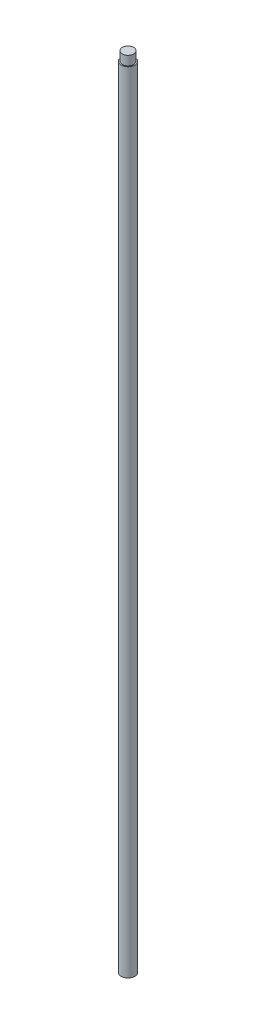
ISO-10303-21;
HEADER;
FILE_DESCRIPTION(('STEP AP214'),'2;1');
FILE_NAME('part.step','',(''),(''),'','','');
FILE_SCHEMA(('AUTOMOTIVE_DESIGN { 1 0 10303 214 1 1 1 1 }'));
ENDSEC;
DATA;
#1=APPLICATION_CONTEXT('core data for automotive mechanical design processes');
#2=APPLICATION_PROTOCOL_DEFINITION('international standard','automotive_design',2000,#1);
#3=PRODUCT_CONTEXT('',#1,'mechanical');
#4=PRODUCT('Part','Part','',(#3));
#5=PRODUCT_RELATED_PRODUCT_CATEGORY('part','',(#4));
#6=PRODUCT_DEFINITION_FORMATION('','',#4);
#7=PRODUCT_DEFINITION_CONTEXT('part definition',#1,'design');
#8=PRODUCT_DEFINITION('design','',#6,#7);
#9=PRODUCT_DEFINITION_SHAPE('','',#8);
#10=(LENGTH_UNIT() NAMED_UNIT(*) SI_UNIT(.MILLI.,.METRE.));
#11=(NAMED_UNIT(*) PLANE_ANGLE_UNIT() SI_UNIT($,.RADIAN.));
#12=(NAMED_UNIT(*) SI_UNIT($,.STERADIAN.) SOLID_ANGLE_UNIT());
#13=UNCERTAINTY_MEASURE_WITH_UNIT(LENGTH_MEASURE(1.E-05),#10,'distance_accuracy_value','');
#14=(GEOMETRIC_REPRESENTATION_CONTEXT(3) GLOBAL_UNCERTAINTY_ASSIGNED_CONTEXT((#13)) GLOBAL_UNIT_ASSIGNED_CONTEXT((#10,
#11,#12)) REPRESENTATION_CONTEXT('',''));
#15=CARTESIAN_POINT('',(0.,0.,0.));
#16=DIRECTION('',(0.,0.,1.));
#17=DIRECTION('',(1.,0.,0.));
#18=AXIS2_PLACEMENT_3D('',#15,#16,#17);
#19=CARTESIAN_POINT('',(0.,-700.,0.));
#20=DIRECTION('',(0.,1.,0.));
#21=DIRECTION('',(0.,0.,1.));
#22=AXIS2_PLACEMENT_3D('',#19,#20,#21);
#23=CYLINDRICAL_SURFACE('',#22,6.);
#24=CARTESIAN_POINT('',(0.,-700.,0.));
#25=DIRECTION('',(0.,1.,0.));
#26=DIRECTION('',(0.,0.,1.));
#27=AXIS2_PLACEMENT_3D('',#24,#25,#26);
#28=CIRCLE('',#27,6.);
#29=CARTESIAN_POINT('',(0.,-700.,6.));
#30=VERTEX_POINT('',#29);
#31=EDGE_CURVE('E10',#30,#30,#28,.T.);
#32=ORIENTED_EDGE('',*,*,#31,.T.);
#33=EDGE_LOOP('',(#32));
#34=FACE_BOUND('',#33,.T.);
#35=CARTESIAN_POINT('',(0.,-8.,0.));
#36=DIRECTION('',(0.,1.,0.));
#37=DIRECTION('',(0.,0.,1.));
#38=AXIS2_PLACEMENT_3D('',#35,#36,#37);
#39=CIRCLE('',#38,6.);
#40=CARTESIAN_POINT('',(0.,-8.,6.));
#41=VERTEX_POINT('',#40);
#42=EDGE_CURVE('E35',#41,#41,#39,.T.);
#43=ORIENTED_EDGE('',*,*,#42,.F.);
#44=EDGE_LOOP('',(#43));
#45=FACE_BOUND('',#44,.T.);
#46=ADVANCED_FACE('F29',(#34,#45),#23,.T.);
#47=CARTESIAN_POINT('',(0.,-700.,0.));
#48=DIRECTION('',(0.,1.,0.));
#49=DIRECTION('',(0.,0.,1.));
#50=AXIS2_PLACEMENT_3D('',#47,#48,#49);
#51=PLANE('',#50);
#52=ORIENTED_EDGE('',*,*,#31,.F.);
#53=EDGE_LOOP('',(#52));
#54=FACE_BOUND('',#53,.T.);
#55=ADVANCED_FACE('F60',(#54),#51,.F.);
#56=CARTESIAN_POINT('',(0.,-8.,0.));
#57=DIRECTION('',(0.,1.,0.));
#58=DIRECTION('',(0.,0.,1.));
#59=AXIS2_PLACEMENT_3D('',#56,#57,#58);
#60=PLANE('',#59);
#61=CARTESIAN_POINT('',(0.,-8.,0.));
#62=DIRECTION('',(0.,1.,0.));
#63=DIRECTION('',(0.,0.,1.));
#64=AXIS2_PLACEMENT_3D('',#61,#62,#63);
#65=CIRCLE('',#64,5.);
#66=CARTESIAN_POINT('',(0.,-8.,5.));
#67=VERTEX_POINT('',#66);
#68=EDGE_CURVE('E39',#67,#67,#65,.T.);
#69=ORIENTED_EDGE('',*,*,#68,.F.);
#70=EDGE_LOOP('',(#69));
#71=FACE_BOUND('',#70,.T.);
#72=ORIENTED_EDGE('',*,*,#42,.T.);
#73=EDGE_LOOP('',(#72));
#74=FACE_BOUND('',#73,.T.);
#75=ADVANCED_FACE('F53',(#71,#74),#60,.T.);
#76=CARTESIAN_POINT('',(0.,-8.,0.));
#77=DIRECTION('',(0.,1.,0.));
#78=DIRECTION('',(0.,0.,1.));
#79=AXIS2_PLACEMENT_3D('',#76,#77,#78);
#80=CYLINDRICAL_SURFACE('',#79,5.);
#81=ORIENTED_EDGE('',*,*,#68,.T.);
#82=EDGE_LOOP('',(#81));
#83=FACE_BOUND('',#82,.T.);
#84=CARTESIAN_POINT('',(0.,0.,0.));
#85=DIRECTION('',(0.,1.,0.));
#86=DIRECTION('',(0.,0.,1.));
#87=AXIS2_PLACEMENT_3D('',#84,#85,#86);
#88=CIRCLE('',#87,5.);
#89=CARTESIAN_POINT('',(0.,0.,5.));
#90=VERTEX_POINT('',#89);
#91=EDGE_CURVE('E43',#90,#90,#88,.T.);
#92=ORIENTED_EDGE('',*,*,#91,.F.);
#93=EDGE_LOOP('',(#92));
#94=FACE_BOUND('',#93,.T.);
#95=ADVANCED_FACE('F51',(#83,#94),#80,.T.);
#96=CARTESIAN_POINT('',(0.,0.,0.));
#97=DIRECTION('',(0.,1.,0.));
#98=DIRECTION('',(0.,0.,1.));
#99=AXIS2_PLACEMENT_3D('',#96,#97,#98);
#100=PLANE('',#99);
#101=ORIENTED_EDGE('',*,*,#91,.T.);
#102=EDGE_LOOP('',(#101));
#103=FACE_BOUND('',#102,.T.);
#104=ADVANCED_FACE('F49',(#103),#100,.T.);
#105=CLOSED_SHELL('',(#46,#55,#75,#95,#104));
#106=MANIFOLD_SOLID_BREP('B2',#105);
#107=ADVANCED_BREP_SHAPE_REPRESENTATION('',(#18,#106),#14);
#108=SHAPE_DEFINITION_REPRESENTATION(#9,#107);
ENDSEC;
END-ISO-10303-21;
